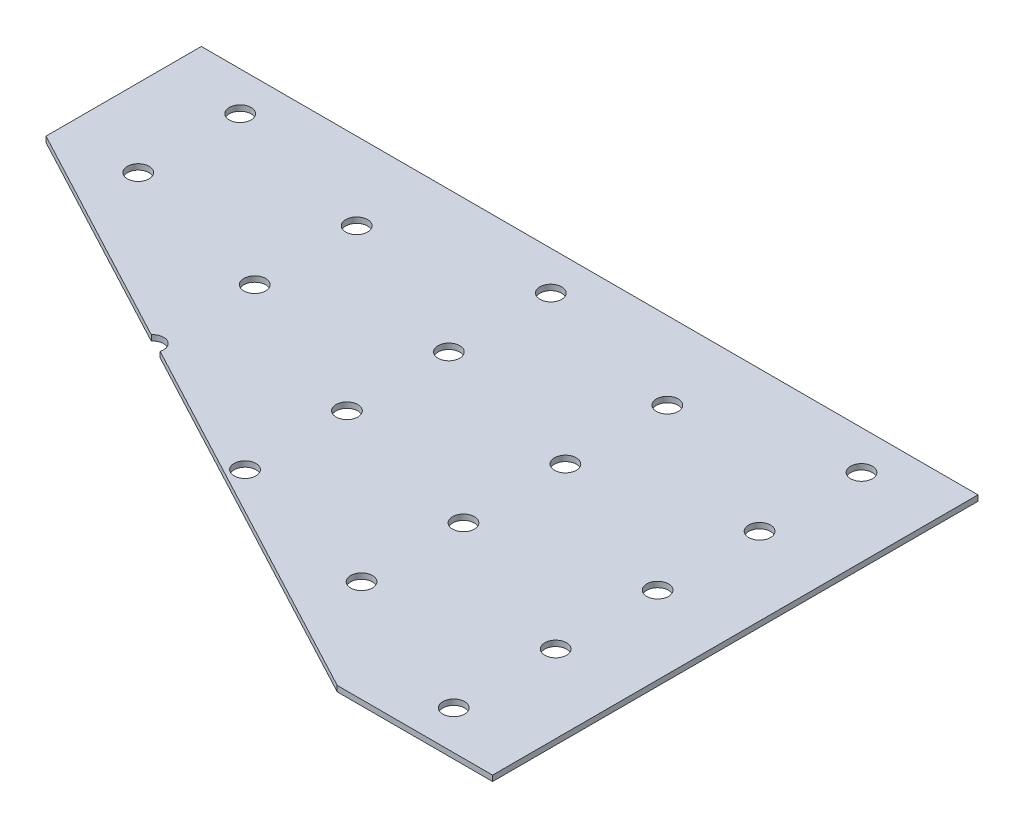
ISO-10303-21;
HEADER;
FILE_DESCRIPTION(('STEP AP214'),'2;1');
FILE_NAME('part.step','',(''),(''),'','','');
FILE_SCHEMA(('AUTOMOTIVE_DESIGN { 1 0 10303 214 1 1 1 1 }'));
ENDSEC;
DATA;
#1=APPLICATION_CONTEXT('core data for automotive mechanical design processes');
#2=APPLICATION_PROTOCOL_DEFINITION('international standard','automotive_design',2000,#1);
#3=PRODUCT_CONTEXT('',#1,'mechanical');
#4=PRODUCT('Part','Part','',(#3));
#5=PRODUCT_RELATED_PRODUCT_CATEGORY('part','',(#4));
#6=PRODUCT_DEFINITION_FORMATION('','',#4);
#7=PRODUCT_DEFINITION_CONTEXT('part definition',#1,'design');
#8=PRODUCT_DEFINITION('design','',#6,#7);
#9=PRODUCT_DEFINITION_SHAPE('','',#8);
#10=(LENGTH_UNIT() NAMED_UNIT(*) SI_UNIT(.MILLI.,.METRE.));
#11=(NAMED_UNIT(*) PLANE_ANGLE_UNIT() SI_UNIT($,.RADIAN.));
#12=(NAMED_UNIT(*) SI_UNIT($,.STERADIAN.) SOLID_ANGLE_UNIT());
#13=UNCERTAINTY_MEASURE_WITH_UNIT(LENGTH_MEASURE(1.E-05),#10,'distance_accuracy_value','');
#14=(GEOMETRIC_REPRESENTATION_CONTEXT(3) GLOBAL_UNCERTAINTY_ASSIGNED_CONTEXT((#13)) GLOBAL_UNIT_ASSIGNED_CONTEXT((#10,
#11,#12)) REPRESENTATION_CONTEXT('',''));
#15=CARTESIAN_POINT('',(0.,0.,0.));
#16=DIRECTION('',(0.,0.,1.));
#17=DIRECTION('',(1.,0.,0.));
#18=AXIS2_PLACEMENT_3D('',#15,#16,#17);
#19=CARTESIAN_POINT('',(0.,0.9144,0.));
#20=DIRECTION('',(0.,1.,0.));
#21=DIRECTION('',(0.,0.,1.));
#22=AXIS2_PLACEMENT_3D('',#19,#20,#21);
#23=PLANE('',#22);
#24=CARTESIAN_POINT('',(-50.8,0.9144,-33.3375));
#25=DIRECTION('',(0.,1.,0.));
#26=DIRECTION('',(0.,0.,1.));
#27=AXIS2_PLACEMENT_3D('',#24,#25,#26);
#28=CIRCLE('',#27,1.778);
#29=CARTESIAN_POINT('',(-50.8,0.9144,-31.5595));
#30=VERTEX_POINT('',#29);
#31=EDGE_CURVE('E177',#30,#30,#28,.F.);
#32=ORIENTED_EDGE('',*,*,#31,.T.);
#33=EDGE_LOOP('',(#32));
#34=FACE_BOUND('',#33,.T.);
#35=CARTESIAN_POINT('',(25.4,0.9144,23.01875));
#36=DIRECTION('',(0.,1.,0.));
#37=DIRECTION('',(0.,0.,1.));
#38=AXIS2_PLACEMENT_3D('',#35,#36,#37);
#39=CIRCLE('',#38,1.778);
#40=CARTESIAN_POINT('',(25.4,0.9144,24.79675));
#41=VERTEX_POINT('',#40);
#42=EDGE_CURVE('E180',#41,#41,#39,.F.);
#43=ORIENTED_EDGE('',*,*,#42,.T.);
#44=EDGE_LOOP('',(#43));
#45=FACE_BOUND('',#44,.T.);
#46=CARTESIAN_POINT('',(25.4,0.9144,6.35));
#47=DIRECTION('',(0.,1.,0.));
#48=DIRECTION('',(0.,0.,1.));
#49=AXIS2_PLACEMENT_3D('',#46,#47,#48);
#50=CIRCLE('',#49,1.778);
#51=CARTESIAN_POINT('',(25.4,0.9144,8.128));
#52=VERTEX_POINT('',#51);
#53=EDGE_CURVE('E183',#52,#52,#50,.F.);
#54=ORIENTED_EDGE('',*,*,#53,.T.);
#55=EDGE_LOOP('',(#54));
#56=FACE_BOUND('',#55,.T.);
#57=CARTESIAN_POINT('',(25.4,0.9144,-10.31875));
#58=DIRECTION('',(0.,1.,0.));
#59=DIRECTION('',(0.,0.,1.));
#60=AXIS2_PLACEMENT_3D('',#57,#58,#59);
#61=CIRCLE('',#60,1.778);
#62=CARTESIAN_POINT('',(25.4,0.9144,-8.54075));
#63=VERTEX_POINT('',#62);
#64=EDGE_CURVE('E186',#63,#63,#61,.F.);
#65=ORIENTED_EDGE('',*,*,#64,.T.);
#66=EDGE_LOOP('',(#65));
#67=FACE_BOUND('',#66,.T.);
#68=CARTESIAN_POINT('',(-25.4,0.9144,-10.31875));
#69=DIRECTION('',(0.,1.,0.));
#70=DIRECTION('',(0.,0.,1.));
#71=AXIS2_PLACEMENT_3D('',#68,#69,#70);
#72=CIRCLE('',#71,1.778);
#73=CARTESIAN_POINT('',(-25.4,0.9144,-8.54075));
#74=VERTEX_POINT('',#73);
#75=EDGE_CURVE('E189',#74,#74,#72,.F.);
#76=ORIENTED_EDGE('',*,*,#75,.T.);
#77=EDGE_LOOP('',(#76));
#78=FACE_BOUND('',#77,.T.);
#79=CARTESIAN_POINT('',(25.4,0.9144,-26.9875));
#80=DIRECTION('',(0.,1.,0.));
#81=DIRECTION('',(0.,0.,1.));
#82=AXIS2_PLACEMENT_3D('',#79,#80,#81);
#83=CIRCLE('',#82,1.778);
#84=CARTESIAN_POINT('',(25.4,0.9144,-25.2095));
#85=VERTEX_POINT('',#84);
#86=EDGE_CURVE('E192',#85,#85,#83,.F.);
#87=ORIENTED_EDGE('',*,*,#86,.T.);
#88=EDGE_LOOP('',(#87));
#89=FACE_BOUND('',#88,.T.);
#90=CARTESIAN_POINT('',(-25.4,0.9144,-26.9875));
#91=DIRECTION('',(0.,1.,0.));
#92=DIRECTION('',(0.,0.,1.));
#93=AXIS2_PLACEMENT_3D('',#90,#91,#92);
#94=CIRCLE('',#93,1.778);
#95=CARTESIAN_POINT('',(-25.4,0.9144,-25.2095));
#96=VERTEX_POINT('',#95);
#97=EDGE_CURVE('E195',#96,#96,#94,.F.);
#98=ORIENTED_EDGE('',*,*,#97,.T.);
#99=EDGE_LOOP('',(#98));
#100=FACE_BOUND('',#99,.T.);
#101=CARTESIAN_POINT('',(50.8,0.9144,33.3375));
#102=DIRECTION('',(0.,1.,0.));
#103=DIRECTION('',(0.,0.,1.));
#104=AXIS2_PLACEMENT_3D('',#101,#102,#103);
#105=CIRCLE('',#104,1.778);
#106=CARTESIAN_POINT('',(50.8,0.9144,35.1155));
#107=VERTEX_POINT('',#106);
#108=EDGE_CURVE('E198',#107,#107,#105,.F.);
#109=ORIENTED_EDGE('',*,*,#108,.T.);
#110=EDGE_LOOP('',(#109));
#111=FACE_BOUND('',#110,.T.);
#112=CARTESIAN_POINT('',(50.8,0.9144,16.66875));
#113=DIRECTION('',(0.,1.,0.));
#114=DIRECTION('',(0.,0.,1.));
#115=AXIS2_PLACEMENT_3D('',#112,#113,#114);
#116=CIRCLE('',#115,1.778);
#117=CARTESIAN_POINT('',(50.8,0.9144,18.44675));
#118=VERTEX_POINT('',#117);
#119=EDGE_CURVE('E201',#118,#118,#116,.F.);
#120=ORIENTED_EDGE('',*,*,#119,.T.);
#121=EDGE_LOOP('',(#120));
#122=FACE_BOUND('',#121,.T.);
#123=CARTESIAN_POINT('',(0.,0.9144,16.66875));
#124=DIRECTION('',(0.,1.,0.));
#125=DIRECTION('',(0.,0.,1.));
#126=AXIS2_PLACEMENT_3D('',#123,#124,#125);
#127=CIRCLE('',#126,1.778);
#128=CARTESIAN_POINT('',(0.,0.9144,18.44675));
#129=VERTEX_POINT('',#128);
#130=EDGE_CURVE('E204',#129,#129,#127,.F.);
#131=ORIENTED_EDGE('',*,*,#130,.T.);
#132=EDGE_LOOP('',(#131));
#133=FACE_BOUND('',#132,.T.);
#134=CARTESIAN_POINT('',(50.8,0.9144,0.));
#135=DIRECTION('',(0.,1.,0.));
#136=DIRECTION('',(0.,0.,1.));
#137=AXIS2_PLACEMENT_3D('',#134,#135,#136);
#138=CIRCLE('',#137,1.778);
#139=CARTESIAN_POINT('',(50.8,0.9144,1.778));
#140=VERTEX_POINT('',#139);
#141=EDGE_CURVE('E207',#140,#140,#138,.F.);
#142=ORIENTED_EDGE('',*,*,#141,.T.);
#143=EDGE_LOOP('',(#142));
#144=FACE_BOUND('',#143,.T.);
#145=CARTESIAN_POINT('',(0.,0.9144,0.));
#146=DIRECTION('',(0.,1.,0.));
#147=DIRECTION('',(0.,0.,1.));
#148=AXIS2_PLACEMENT_3D('',#145,#146,#147);
#149=CIRCLE('',#148,1.778);
#150=CARTESIAN_POINT('',(0.,0.9144,1.778));
#151=VERTEX_POINT('',#150);
#152=EDGE_CURVE('E210',#151,#151,#149,.F.);
#153=ORIENTED_EDGE('',*,*,#152,.T.);
#154=EDGE_LOOP('',(#153));
#155=FACE_BOUND('',#154,.T.);
#156=CARTESIAN_POINT('',(50.8,0.9144,-16.66875));
#157=DIRECTION('',(0.,1.,0.));
#158=DIRECTION('',(0.,0.,1.));
#159=AXIS2_PLACEMENT_3D('',#156,#157,#158);
#160=CIRCLE('',#159,1.778);
#161=CARTESIAN_POINT('',(50.8,0.9144,-14.89075));
#162=VERTEX_POINT('',#161);
#163=EDGE_CURVE('E213',#162,#162,#160,.F.);
#164=ORIENTED_EDGE('',*,*,#163,.T.);
#165=EDGE_LOOP('',(#164));
#166=FACE_BOUND('',#165,.T.);
#167=CARTESIAN_POINT('',(0.,0.9144,-16.66875));
#168=DIRECTION('',(0.,1.,0.));
#169=DIRECTION('',(0.,0.,1.));
#170=AXIS2_PLACEMENT_3D('',#167,#168,#169);
#171=CIRCLE('',#170,1.778);
#172=CARTESIAN_POINT('',(0.,0.9144,-14.89075));
#173=VERTEX_POINT('',#172);
#174=EDGE_CURVE('E216',#173,#173,#171,.F.);
#175=ORIENTED_EDGE('',*,*,#174,.T.);
#176=EDGE_LOOP('',(#175));
#177=FACE_BOUND('',#176,.T.);
#178=CARTESIAN_POINT('',(-50.8,0.9144,-16.66875));
#179=DIRECTION('',(0.,1.,0.));
#180=DIRECTION('',(0.,0.,1.));
#181=AXIS2_PLACEMENT_3D('',#178,#179,#180);
#182=CIRCLE('',#181,1.778);
#183=CARTESIAN_POINT('',(-50.8,0.9144,-14.89075));
#184=VERTEX_POINT('',#183);
#185=EDGE_CURVE('E219',#184,#184,#182,.F.);
#186=ORIENTED_EDGE('',*,*,#185,.T.);
#187=EDGE_LOOP('',(#186));
#188=FACE_BOUND('',#187,.T.);
#189=CARTESIAN_POINT('',(50.8,0.9144,-33.3375));
#190=DIRECTION('',(0.,1.,0.));
#191=DIRECTION('',(0.,0.,1.));
#192=AXIS2_PLACEMENT_3D('',#189,#190,#191);
#193=CIRCLE('',#192,1.778);
#194=CARTESIAN_POINT('',(50.8,0.9144,-31.5595));
#195=VERTEX_POINT('',#194);
#196=EDGE_CURVE('E222',#195,#195,#193,.F.);
#197=ORIENTED_EDGE('',*,*,#196,.T.);
#198=EDGE_LOOP('',(#197));
#199=FACE_BOUND('',#198,.T.);
#200=CARTESIAN_POINT('',(0.,0.9144,-33.3375));
#201=DIRECTION('',(0.,1.,0.));
#202=DIRECTION('',(0.,0.,1.));
#203=AXIS2_PLACEMENT_3D('',#200,#201,#202);
#204=CIRCLE('',#203,1.778);
#205=CARTESIAN_POINT('',(0.,0.9144,-31.5595));
#206=VERTEX_POINT('',#205);
#207=EDGE_CURVE('E224',#206,#206,#204,.F.);
#208=ORIENTED_EDGE('',*,*,#207,.T.);
#209=EDGE_LOOP('',(#208));
#210=FACE_BOUND('',#209,.T.);
#211=CARTESIAN_POINT('',(-25.4,0.9144,6.35));
#212=DIRECTION('',(0.,1.,0.));
#213=DIRECTION('',(0.,0.,1.));
#214=AXIS2_PLACEMENT_3D('',#211,#212,#213);
#215=CIRCLE('',#214,1.778);
#216=CARTESIAN_POINT('',(-26.7749379564742,0.9144,5.22268921062267));
#217=VERTEX_POINT('',#216);
#218=CARTESIAN_POINT('',(-23.6961968493143,0.9144,6.85827042380374));
#219=VERTEX_POINT('',#218);
#220=EDGE_CURVE('E19',#217,#219,#215,.F.);
#221=ORIENTED_EDGE('',*,*,#220,.T.);
#222=DIRECTION('',(-0.883115719457429,0.,-0.469155225961715));
#223=VECTOR('',#222,1.);
#224=CARTESIAN_POINT('',(38.1,0.9144,39.6875));
#225=LINE('',#224,#223);
#226=CARTESIAN_POINT('',(38.1,0.9144,39.6875));
#227=VERTEX_POINT('',#226);
#228=EDGE_CURVE('E91',#219,#227,#225,.F.);
#229=ORIENTED_EDGE('',*,*,#228,.T.);
#230=DIRECTION('',(1.,0.,0.));
#231=VECTOR('',#230,1.);
#232=CARTESIAN_POINT('',(-63.5,0.9144,39.6875));
#233=LINE('',#232,#231);
#234=CARTESIAN_POINT('',(63.5,0.9144,39.6875));
#235=VERTEX_POINT('',#234);
#236=EDGE_CURVE('E83',#235,#227,#233,.F.);
#237=ORIENTED_EDGE('',*,*,#236,.F.);
#238=DIRECTION('',(0.,0.,-1.));
#239=VECTOR('',#238,1.);
#240=CARTESIAN_POINT('',(63.5,0.9144,39.6875));
#241=LINE('',#240,#239);
#242=CARTESIAN_POINT('',(63.5,0.9144,-39.6875));
#243=VERTEX_POINT('',#242);
#244=EDGE_CURVE('E78',#243,#235,#241,.F.);
#245=ORIENTED_EDGE('',*,*,#244,.F.);
#246=DIRECTION('',(-1.,0.,0.));
#247=VECTOR('',#246,1.);
#248=CARTESIAN_POINT('',(63.5,0.9144,-39.6875));
#249=LINE('',#248,#247);
#250=CARTESIAN_POINT('',(-63.5,0.9144,-39.6875));
#251=VERTEX_POINT('',#250);
#252=EDGE_CURVE('E119',#251,#243,#249,.F.);
#253=ORIENTED_EDGE('',*,*,#252,.F.);
#254=DIRECTION('',(0.,0.,1.));
#255=VECTOR('',#254,1.);
#256=CARTESIAN_POINT('',(-63.5,0.9144,-39.6875));
#257=LINE('',#256,#255);
#258=CARTESIAN_POINT('',(-63.5000000000014,0.9144,-14.2874999999974));
#259=VERTEX_POINT('',#258);
#260=EDGE_CURVE('E58',#259,#251,#257,.F.);
#261=ORIENTED_EDGE('',*,*,#260,.F.);
#262=DIRECTION('',(-0.883115719457429,0.,-0.469155225961715));
#263=VECTOR('',#262,1.);
#264=CARTESIAN_POINT('',(38.1,0.9144,39.6875));
#265=LINE('',#264,#263);
#266=EDGE_CURVE('E107',#259,#217,#265,.F.);
#267=ORIENTED_EDGE('',*,*,#266,.T.);
#268=EDGE_LOOP('',(#221,#229,#237,#245,#253,#261,#267));
#269=FACE_BOUND('',#268,.T.);
#270=ADVANCED_FACE('F16',(#34,#45,#56,#67,#78,#89,#100,#111,#122,#133,#144,#155,#166,#177,#188,
#199,#210,#269),#23,.T.);
#271=CARTESIAN_POINT('',(38.1,0.9144,39.6875));
#272=DIRECTION('',(0.469155225961715,0.,-0.883115719457429));
#273=DIRECTION('',(-0.883115719457429,0.,-0.469155225961715));
#274=AXIS2_PLACEMENT_3D('',#271,#272,#273);
#275=PLANE('',#274);
#276=ORIENTED_EDGE('',*,*,#228,.F.);
#277=DIRECTION('',(0.,1.,0.));
#278=VECTOR('',#277,1.);
#279=CARTESIAN_POINT('',(-23.6961968493141,0.9144,6.85827042380281));
#280=LINE('',#279,#278);
#281=CARTESIAN_POINT('',(-23.6961968493141,0.,6.8582704238029));
#282=VERTEX_POINT('',#281);
#283=EDGE_CURVE('E228',#219,#282,#280,.F.);
#284=ORIENTED_EDGE('',*,*,#283,.T.);
#285=DIRECTION('',(0.883115719457417,0.,0.469155225961737));
#286=VECTOR('',#285,1.);
#287=CARTESIAN_POINT('',(-23.6961968493149,0.,6.85827042380256));
#288=LINE('',#287,#286);
#289=CARTESIAN_POINT('',(38.1,0.,39.6875));
#290=VERTEX_POINT('',#289);
#291=EDGE_CURVE('E98',#282,#290,#288,.T.);
#292=ORIENTED_EDGE('',*,*,#291,.T.);
#293=DIRECTION('',(0.,1.,0.));
#294=VECTOR('',#293,1.);
#295=CARTESIAN_POINT('',(38.1,0.,39.6875));
#296=LINE('',#295,#294);
#297=EDGE_CURVE('E88',#227,#290,#296,.F.);
#298=ORIENTED_EDGE('',*,*,#297,.F.);
#299=EDGE_LOOP('',(#276,#284,#292,#298));
#300=FACE_BOUND('',#299,.T.);
#301=ADVANCED_FACE('F97',(#300),#275,.F.);
#302=CARTESIAN_POINT('',(-63.5,0.,39.6875));
#303=DIRECTION('',(0.,0.,1.));
#304=DIRECTION('',(1.,0.,0.));
#305=AXIS2_PLACEMENT_3D('',#302,#303,#304);
#306=PLANE('',#305);
#307=ORIENTED_EDGE('',*,*,#236,.T.);
#308=ORIENTED_EDGE('',*,*,#297,.T.);
#309=DIRECTION('',(1.,0.,0.));
#310=VECTOR('',#309,1.);
#311=CARTESIAN_POINT('',(0.,0.,39.6875));
#312=LINE('',#311,#310);
#313=CARTESIAN_POINT('',(63.5,0.,39.6875));
#314=VERTEX_POINT('',#313);
#315=EDGE_CURVE('E259',#290,#314,#312,.T.);
#316=ORIENTED_EDGE('',*,*,#315,.T.);
#317=DIRECTION('',(0.,1.,0.));
#318=VECTOR('',#317,1.);
#319=CARTESIAN_POINT('',(63.5,0.,39.6875));
#320=LINE('',#319,#318);
#321=EDGE_CURVE('E90',#235,#314,#320,.F.);
#322=ORIENTED_EDGE('',*,*,#321,.F.);
#323=EDGE_LOOP('',(#307,#308,#316,#322));
#324=FACE_BOUND('',#323,.T.);
#325=ADVANCED_FACE('F85',(#324),#306,.T.);
#326=CARTESIAN_POINT('',(63.5,0.,39.6875));
#327=DIRECTION('',(1.,0.,0.));
#328=DIRECTION('',(0.,0.,-1.));
#329=AXIS2_PLACEMENT_3D('',#326,#327,#328);
#330=PLANE('',#329);
#331=ORIENTED_EDGE('',*,*,#321,.T.);
#332=DIRECTION('',(0.,0.,1.));
#333=VECTOR('',#332,1.);
#334=CARTESIAN_POINT('',(63.5,0.,0.));
#335=LINE('',#334,#333);
#336=CARTESIAN_POINT('',(63.5,0.,-39.6875));
#337=VERTEX_POINT('',#336);
#338=EDGE_CURVE('E251',#314,#337,#335,.F.);
#339=ORIENTED_EDGE('',*,*,#338,.T.);
#340=DIRECTION('',(0.,1.,0.));
#341=VECTOR('',#340,1.);
#342=CARTESIAN_POINT('',(63.5,0.,-39.6875));
#343=LINE('',#342,#341);
#344=EDGE_CURVE('E116',#243,#337,#343,.F.);
#345=ORIENTED_EDGE('',*,*,#344,.F.);
#346=ORIENTED_EDGE('',*,*,#244,.T.);
#347=EDGE_LOOP('',(#331,#339,#345,#346));
#348=FACE_BOUND('',#347,.T.);
#349=ADVANCED_FACE('F281',(#348),#330,.T.);
#350=CARTESIAN_POINT('',(63.5,0.,-39.6875));
#351=DIRECTION('',(0.,0.,-1.));
#352=DIRECTION('',(-1.,0.,0.));
#353=AXIS2_PLACEMENT_3D('',#350,#351,#352);
#354=PLANE('',#353);
#355=ORIENTED_EDGE('',*,*,#344,.T.);
#356=DIRECTION('',(1.,0.,0.));
#357=VECTOR('',#356,1.);
#358=CARTESIAN_POINT('',(0.,0.,-39.6875));
#359=LINE('',#358,#357);
#360=CARTESIAN_POINT('',(-63.5,0.,-39.6875));
#361=VERTEX_POINT('',#360);
#362=EDGE_CURVE('E242',#337,#361,#359,.F.);
#363=ORIENTED_EDGE('',*,*,#362,.T.);
#364=DIRECTION('',(0.,1.,0.));
#365=VECTOR('',#364,1.);
#366=CARTESIAN_POINT('',(-63.5,0.,-39.6875));
#367=LINE('',#366,#365);
#368=EDGE_CURVE('E115',#251,#361,#367,.F.);
#369=ORIENTED_EDGE('',*,*,#368,.F.);
#370=ORIENTED_EDGE('',*,*,#252,.T.);
#371=EDGE_LOOP('',(#355,#363,#369,#370));
#372=FACE_BOUND('',#371,.T.);
#373=ADVANCED_FACE('F279',(#372),#354,.T.);
#374=CARTESIAN_POINT('',(-63.5,0.,-39.6875));
#375=DIRECTION('',(-1.,0.,0.));
#376=DIRECTION('',(0.,0.,1.));
#377=AXIS2_PLACEMENT_3D('',#374,#375,#376);
#378=PLANE('',#377);
#379=DIRECTION('',(0.,0.,1.));
#380=VECTOR('',#379,1.);
#381=CARTESIAN_POINT('',(-63.5,0.,0.));
#382=LINE('',#381,#380);
#383=CARTESIAN_POINT('',(-63.5000000000007,0.,-14.2874999999987));
#384=VERTEX_POINT('',#383);
#385=EDGE_CURVE('E239',#361,#384,#382,.T.);
#386=ORIENTED_EDGE('',*,*,#385,.T.);
#387=DIRECTION('',(0.,1.,0.));
#388=VECTOR('',#387,1.);
#389=CARTESIAN_POINT('',(-63.5000000000021,0.9144,-14.2874999999961));
#390=LINE('',#389,#388);
#391=EDGE_CURVE('E109',#384,#259,#390,.T.);
#392=ORIENTED_EDGE('',*,*,#391,.T.);
#393=ORIENTED_EDGE('',*,*,#260,.T.);
#394=ORIENTED_EDGE('',*,*,#368,.T.);
#395=EDGE_LOOP('',(#386,#392,#393,#394));
#396=FACE_BOUND('',#395,.T.);
#397=ADVANCED_FACE('F276',(#396),#378,.T.);
#398=CARTESIAN_POINT('',(38.1,0.9144,39.6875));
#399=DIRECTION('',(0.469155225961715,0.,-0.883115719457429));
#400=DIRECTION('',(-0.883115719457429,0.,-0.469155225961715));
#401=AXIS2_PLACEMENT_3D('',#398,#399,#400);
#402=PLANE('',#401);
#403=ORIENTED_EDGE('',*,*,#266,.F.);
#404=ORIENTED_EDGE('',*,*,#391,.F.);
#405=DIRECTION('',(0.883115719457441,0.,0.469155225961693));
#406=VECTOR('',#405,1.);
#407=CARTESIAN_POINT('',(-63.5,0.,-14.2875));
#408=LINE('',#407,#406);
#409=CARTESIAN_POINT('',(-26.7749379564724,0.,5.2226892106205));
#410=VERTEX_POINT('',#409);
#411=EDGE_CURVE('E176',#384,#410,#408,.T.);
#412=ORIENTED_EDGE('',*,*,#411,.T.);
#413=DIRECTION('',(0.,1.,0.));
#414=VECTOR('',#413,1.);
#415=CARTESIAN_POINT('',(-26.7749379564721,0.9144,5.22268921062014));
#416=LINE('',#415,#414);
#417=EDGE_CURVE('E34',#410,#217,#416,.T.);
#418=ORIENTED_EDGE('',*,*,#417,.T.);
#419=EDGE_LOOP('',(#403,#404,#412,#418));
#420=FACE_BOUND('',#419,.T.);
#421=ADVANCED_FACE('F270',(#420),#402,.F.);
#422=CARTESIAN_POINT('',(-25.4,0.9144,6.35));
#423=DIRECTION('',(0.,1.,0.));
#424=DIRECTION('',(0.,0.,1.));
#425=AXIS2_PLACEMENT_3D('',#422,#423,#424);
#426=CYLINDRICAL_SURFACE('',#425,1.778);
#427=CARTESIAN_POINT('',(-25.4,0.,6.35));
#428=DIRECTION('',(0.,1.,0.));
#429=DIRECTION('',(0.,0.,1.));
#430=AXIS2_PLACEMENT_3D('',#427,#428,#429);
#431=CIRCLE('',#430,1.778);
#432=EDGE_CURVE('E174',#410,#282,#431,.F.);
#433=ORIENTED_EDGE('',*,*,#432,.T.);
#434=ORIENTED_EDGE('',*,*,#283,.F.);
#435=ORIENTED_EDGE('',*,*,#220,.F.);
#436=ORIENTED_EDGE('',*,*,#417,.F.);
#437=EDGE_LOOP('',(#433,#434,#435,#436));
#438=FACE_BOUND('',#437,.T.);
#439=ADVANCED_FACE('F366',(#438),#426,.F.);
#440=CARTESIAN_POINT('',(0.,0.9144,-33.3375));
#441=DIRECTION('',(0.,1.,0.));
#442=DIRECTION('',(0.,0.,1.));
#443=AXIS2_PLACEMENT_3D('',#440,#441,#442);
#444=CYLINDRICAL_SURFACE('',#443,1.778);
#445=ORIENTED_EDGE('',*,*,#207,.F.);
#446=EDGE_LOOP('',(#445));
#447=FACE_BOUND('',#446,.T.);
#448=CARTESIAN_POINT('',(0.,0.,-33.3375));
#449=DIRECTION('',(0.,1.,0.));
#450=DIRECTION('',(0.,0.,1.));
#451=AXIS2_PLACEMENT_3D('',#448,#449,#450);
#452=CIRCLE('',#451,1.778);
#453=CARTESIAN_POINT('',(0.,0.,-31.5595));
#454=VERTEX_POINT('',#453);
#455=EDGE_CURVE('E171',#454,#454,#452,.F.);
#456=ORIENTED_EDGE('',*,*,#455,.T.);
#457=EDGE_LOOP('',(#456));
#458=FACE_BOUND('',#457,.T.);
#459=ADVANCED_FACE('F362',(#447,#458),#444,.F.);
#460=CARTESIAN_POINT('',(50.8,0.9144,-33.3375));
#461=DIRECTION('',(0.,1.,0.));
#462=DIRECTION('',(0.,0.,1.));
#463=AXIS2_PLACEMENT_3D('',#460,#461,#462);
#464=CYLINDRICAL_SURFACE('',#463,1.778);
#465=ORIENTED_EDGE('',*,*,#196,.F.);
#466=EDGE_LOOP('',(#465));
#467=FACE_BOUND('',#466,.T.);
#468=CARTESIAN_POINT('',(50.8,0.,-33.3375));
#469=DIRECTION('',(0.,1.,0.));
#470=DIRECTION('',(0.,0.,1.));
#471=AXIS2_PLACEMENT_3D('',#468,#469,#470);
#472=CIRCLE('',#471,1.778);
#473=CARTESIAN_POINT('',(50.8,0.,-31.5595));
#474=VERTEX_POINT('',#473);
#475=EDGE_CURVE('E168',#474,#474,#472,.F.);
#476=ORIENTED_EDGE('',*,*,#475,.T.);
#477=EDGE_LOOP('',(#476));
#478=FACE_BOUND('',#477,.T.);
#479=ADVANCED_FACE('F358',(#467,#478),#464,.F.);
#480=CARTESIAN_POINT('',(-50.8,0.9144,-16.66875));
#481=DIRECTION('',(0.,1.,0.));
#482=DIRECTION('',(0.,0.,1.));
#483=AXIS2_PLACEMENT_3D('',#480,#481,#482);
#484=CYLINDRICAL_SURFACE('',#483,1.778);
#485=ORIENTED_EDGE('',*,*,#185,.F.);
#486=EDGE_LOOP('',(#485));
#487=FACE_BOUND('',#486,.T.);
#488=CARTESIAN_POINT('',(-50.8,0.,-16.66875));
#489=DIRECTION('',(0.,1.,0.));
#490=DIRECTION('',(0.,0.,1.));
#491=AXIS2_PLACEMENT_3D('',#488,#489,#490);
#492=CIRCLE('',#491,1.778);
#493=CARTESIAN_POINT('',(-50.8,0.,-14.89075));
#494=VERTEX_POINT('',#493);
#495=EDGE_CURVE('E165',#494,#494,#492,.F.);
#496=ORIENTED_EDGE('',*,*,#495,.T.);
#497=EDGE_LOOP('',(#496));
#498=FACE_BOUND('',#497,.T.);
#499=ADVANCED_FACE('F354',(#487,#498),#484,.F.);
#500=CARTESIAN_POINT('',(0.,0.9144,-16.66875));
#501=DIRECTION('',(0.,1.,0.));
#502=DIRECTION('',(0.,0.,1.));
#503=AXIS2_PLACEMENT_3D('',#500,#501,#502);
#504=CYLINDRICAL_SURFACE('',#503,1.778);
#505=ORIENTED_EDGE('',*,*,#174,.F.);
#506=EDGE_LOOP('',(#505));
#507=FACE_BOUND('',#506,.T.);
#508=CARTESIAN_POINT('',(0.,0.,-16.66875));
#509=DIRECTION('',(0.,1.,0.));
#510=DIRECTION('',(0.,0.,1.));
#511=AXIS2_PLACEMENT_3D('',#508,#509,#510);
#512=CIRCLE('',#511,1.778);
#513=CARTESIAN_POINT('',(0.,0.,-14.89075));
#514=VERTEX_POINT('',#513);
#515=EDGE_CURVE('E162',#514,#514,#512,.F.);
#516=ORIENTED_EDGE('',*,*,#515,.T.);
#517=EDGE_LOOP('',(#516));
#518=FACE_BOUND('',#517,.T.);
#519=ADVANCED_FACE('F350',(#507,#518),#504,.F.);
#520=CARTESIAN_POINT('',(50.8,0.9144,-16.66875));
#521=DIRECTION('',(0.,1.,0.));
#522=DIRECTION('',(0.,0.,1.));
#523=AXIS2_PLACEMENT_3D('',#520,#521,#522);
#524=CYLINDRICAL_SURFACE('',#523,1.778);
#525=ORIENTED_EDGE('',*,*,#163,.F.);
#526=EDGE_LOOP('',(#525));
#527=FACE_BOUND('',#526,.T.);
#528=CARTESIAN_POINT('',(50.8,0.,-16.66875));
#529=DIRECTION('',(0.,1.,0.));
#530=DIRECTION('',(0.,0.,1.));
#531=AXIS2_PLACEMENT_3D('',#528,#529,#530);
#532=CIRCLE('',#531,1.778);
#533=CARTESIAN_POINT('',(50.8,0.,-14.89075));
#534=VERTEX_POINT('',#533);
#535=EDGE_CURVE('E159',#534,#534,#532,.F.);
#536=ORIENTED_EDGE('',*,*,#535,.T.);
#537=EDGE_LOOP('',(#536));
#538=FACE_BOUND('',#537,.T.);
#539=ADVANCED_FACE('F346',(#527,#538),#524,.F.);
#540=CARTESIAN_POINT('',(0.,0.9144,0.));
#541=DIRECTION('',(0.,1.,0.));
#542=DIRECTION('',(0.,0.,1.));
#543=AXIS2_PLACEMENT_3D('',#540,#541,#542);
#544=CYLINDRICAL_SURFACE('',#543,1.778);
#545=ORIENTED_EDGE('',*,*,#152,.F.);
#546=EDGE_LOOP('',(#545));
#547=FACE_BOUND('',#546,.T.);
#548=CARTESIAN_POINT('',(0.,0.,0.));
#549=DIRECTION('',(0.,1.,0.));
#550=DIRECTION('',(0.,0.,1.));
#551=AXIS2_PLACEMENT_3D('',#548,#549,#550);
#552=CIRCLE('',#551,1.778);
#553=CARTESIAN_POINT('',(0.,0.,1.778));
#554=VERTEX_POINT('',#553);
#555=EDGE_CURVE('E156',#554,#554,#552,.F.);
#556=ORIENTED_EDGE('',*,*,#555,.T.);
#557=EDGE_LOOP('',(#556));
#558=FACE_BOUND('',#557,.T.);
#559=ADVANCED_FACE('F342',(#547,#558),#544,.F.);
#560=CARTESIAN_POINT('',(50.8,0.9144,0.));
#561=DIRECTION('',(0.,1.,0.));
#562=DIRECTION('',(0.,0.,1.));
#563=AXIS2_PLACEMENT_3D('',#560,#561,#562);
#564=CYLINDRICAL_SURFACE('',#563,1.778);
#565=ORIENTED_EDGE('',*,*,#141,.F.);
#566=EDGE_LOOP('',(#565));
#567=FACE_BOUND('',#566,.T.);
#568=CARTESIAN_POINT('',(50.8,0.,0.));
#569=DIRECTION('',(0.,1.,0.));
#570=DIRECTION('',(0.,0.,1.));
#571=AXIS2_PLACEMENT_3D('',#568,#569,#570);
#572=CIRCLE('',#571,1.778);
#573=CARTESIAN_POINT('',(50.8,0.,1.778));
#574=VERTEX_POINT('',#573);
#575=EDGE_CURVE('E153',#574,#574,#572,.F.);
#576=ORIENTED_EDGE('',*,*,#575,.T.);
#577=EDGE_LOOP('',(#576));
#578=FACE_BOUND('',#577,.T.);
#579=ADVANCED_FACE('F338',(#567,#578),#564,.F.);
#580=CARTESIAN_POINT('',(0.,0.9144,16.66875));
#581=DIRECTION('',(0.,1.,0.));
#582=DIRECTION('',(0.,0.,1.));
#583=AXIS2_PLACEMENT_3D('',#580,#581,#582);
#584=CYLINDRICAL_SURFACE('',#583,1.778);
#585=ORIENTED_EDGE('',*,*,#130,.F.);
#586=EDGE_LOOP('',(#585));
#587=FACE_BOUND('',#586,.T.);
#588=CARTESIAN_POINT('',(0.,0.,16.66875));
#589=DIRECTION('',(0.,1.,0.));
#590=DIRECTION('',(0.,0.,1.));
#591=AXIS2_PLACEMENT_3D('',#588,#589,#590);
#592=CIRCLE('',#591,1.778);
#593=CARTESIAN_POINT('',(0.,0.,18.44675));
#594=VERTEX_POINT('',#593);
#595=EDGE_CURVE('E150',#594,#594,#592,.F.);
#596=ORIENTED_EDGE('',*,*,#595,.T.);
#597=EDGE_LOOP('',(#596));
#598=FACE_BOUND('',#597,.T.);
#599=ADVANCED_FACE('F334',(#587,#598),#584,.F.);
#600=CARTESIAN_POINT('',(50.8,0.9144,16.66875));
#601=DIRECTION('',(0.,1.,0.));
#602=DIRECTION('',(0.,0.,1.));
#603=AXIS2_PLACEMENT_3D('',#600,#601,#602);
#604=CYLINDRICAL_SURFACE('',#603,1.778);
#605=ORIENTED_EDGE('',*,*,#119,.F.);
#606=EDGE_LOOP('',(#605));
#607=FACE_BOUND('',#606,.T.);
#608=CARTESIAN_POINT('',(50.8,0.,16.66875));
#609=DIRECTION('',(0.,1.,0.));
#610=DIRECTION('',(0.,0.,1.));
#611=AXIS2_PLACEMENT_3D('',#608,#609,#610);
#612=CIRCLE('',#611,1.778);
#613=CARTESIAN_POINT('',(50.8,0.,18.44675));
#614=VERTEX_POINT('',#613);
#615=EDGE_CURVE('E147',#614,#614,#612,.F.);
#616=ORIENTED_EDGE('',*,*,#615,.T.);
#617=EDGE_LOOP('',(#616));
#618=FACE_BOUND('',#617,.T.);
#619=ADVANCED_FACE('F330',(#607,#618),#604,.F.);
#620=CARTESIAN_POINT('',(50.8,0.9144,33.3375));
#621=DIRECTION('',(0.,1.,0.));
#622=DIRECTION('',(0.,0.,1.));
#623=AXIS2_PLACEMENT_3D('',#620,#621,#622);
#624=CYLINDRICAL_SURFACE('',#623,1.778);
#625=ORIENTED_EDGE('',*,*,#108,.F.);
#626=EDGE_LOOP('',(#625));
#627=FACE_BOUND('',#626,.T.);
#628=CARTESIAN_POINT('',(50.8,0.,33.3375));
#629=DIRECTION('',(0.,1.,0.));
#630=DIRECTION('',(0.,0.,1.));
#631=AXIS2_PLACEMENT_3D('',#628,#629,#630);
#632=CIRCLE('',#631,1.778);
#633=CARTESIAN_POINT('',(50.8,0.,35.1155));
#634=VERTEX_POINT('',#633);
#635=EDGE_CURVE('E144',#634,#634,#632,.F.);
#636=ORIENTED_EDGE('',*,*,#635,.T.);
#637=EDGE_LOOP('',(#636));
#638=FACE_BOUND('',#637,.T.);
#639=ADVANCED_FACE('F326',(#627,#638),#624,.F.);
#640=CARTESIAN_POINT('',(-25.4,0.9144,-26.9875));
#641=DIRECTION('',(0.,1.,0.));
#642=DIRECTION('',(0.,0.,1.));
#643=AXIS2_PLACEMENT_3D('',#640,#641,#642);
#644=CYLINDRICAL_SURFACE('',#643,1.778);
#645=ORIENTED_EDGE('',*,*,#97,.F.);
#646=EDGE_LOOP('',(#645));
#647=FACE_BOUND('',#646,.T.);
#648=CARTESIAN_POINT('',(-25.4,0.,-26.9875));
#649=DIRECTION('',(0.,1.,0.));
#650=DIRECTION('',(0.,0.,1.));
#651=AXIS2_PLACEMENT_3D('',#648,#649,#650);
#652=CIRCLE('',#651,1.778);
#653=CARTESIAN_POINT('',(-25.4,0.,-25.2095));
#654=VERTEX_POINT('',#653);
#655=EDGE_CURVE('E141',#654,#654,#652,.F.);
#656=ORIENTED_EDGE('',*,*,#655,.T.);
#657=EDGE_LOOP('',(#656));
#658=FACE_BOUND('',#657,.T.);
#659=ADVANCED_FACE('F322',(#647,#658),#644,.F.);
#660=CARTESIAN_POINT('',(25.4,0.9144,-26.9875));
#661=DIRECTION('',(0.,1.,0.));
#662=DIRECTION('',(0.,0.,1.));
#663=AXIS2_PLACEMENT_3D('',#660,#661,#662);
#664=CYLINDRICAL_SURFACE('',#663,1.778);
#665=ORIENTED_EDGE('',*,*,#86,.F.);
#666=EDGE_LOOP('',(#665));
#667=FACE_BOUND('',#666,.T.);
#668=CARTESIAN_POINT('',(25.4,0.,-26.9875));
#669=DIRECTION('',(0.,1.,0.));
#670=DIRECTION('',(0.,0.,1.));
#671=AXIS2_PLACEMENT_3D('',#668,#669,#670);
#672=CIRCLE('',#671,1.778);
#673=CARTESIAN_POINT('',(25.4,0.,-25.2095));
#674=VERTEX_POINT('',#673);
#675=EDGE_CURVE('E138',#674,#674,#672,.F.);
#676=ORIENTED_EDGE('',*,*,#675,.T.);
#677=EDGE_LOOP('',(#676));
#678=FACE_BOUND('',#677,.T.);
#679=ADVANCED_FACE('F318',(#667,#678),#664,.F.);
#680=CARTESIAN_POINT('',(-25.4,0.9144,-10.31875));
#681=DIRECTION('',(0.,1.,0.));
#682=DIRECTION('',(0.,0.,1.));
#683=AXIS2_PLACEMENT_3D('',#680,#681,#682);
#684=CYLINDRICAL_SURFACE('',#683,1.778);
#685=ORIENTED_EDGE('',*,*,#75,.F.);
#686=EDGE_LOOP('',(#685));
#687=FACE_BOUND('',#686,.T.);
#688=CARTESIAN_POINT('',(-25.4,0.,-10.31875));
#689=DIRECTION('',(0.,1.,0.));
#690=DIRECTION('',(0.,0.,1.));
#691=AXIS2_PLACEMENT_3D('',#688,#689,#690);
#692=CIRCLE('',#691,1.778);
#693=CARTESIAN_POINT('',(-25.4,0.,-8.54075));
#694=VERTEX_POINT('',#693);
#695=EDGE_CURVE('E135',#694,#694,#692,.F.);
#696=ORIENTED_EDGE('',*,*,#695,.T.);
#697=EDGE_LOOP('',(#696));
#698=FACE_BOUND('',#697,.T.);
#699=ADVANCED_FACE('F314',(#687,#698),#684,.F.);
#700=CARTESIAN_POINT('',(25.4,0.9144,-10.31875));
#701=DIRECTION('',(0.,1.,0.));
#702=DIRECTION('',(0.,0.,1.));
#703=AXIS2_PLACEMENT_3D('',#700,#701,#702);
#704=CYLINDRICAL_SURFACE('',#703,1.778);
#705=ORIENTED_EDGE('',*,*,#64,.F.);
#706=EDGE_LOOP('',(#705));
#707=FACE_BOUND('',#706,.T.);
#708=CARTESIAN_POINT('',(25.4,0.,-10.31875));
#709=DIRECTION('',(0.,1.,0.));
#710=DIRECTION('',(0.,0.,1.));
#711=AXIS2_PLACEMENT_3D('',#708,#709,#710);
#712=CIRCLE('',#711,1.778);
#713=CARTESIAN_POINT('',(25.4,0.,-8.54075));
#714=VERTEX_POINT('',#713);
#715=EDGE_CURVE('E132',#714,#714,#712,.F.);
#716=ORIENTED_EDGE('',*,*,#715,.T.);
#717=EDGE_LOOP('',(#716));
#718=FACE_BOUND('',#717,.T.);
#719=ADVANCED_FACE('F310',(#707,#718),#704,.F.);
#720=CARTESIAN_POINT('',(25.4,0.9144,6.35));
#721=DIRECTION('',(0.,1.,0.));
#722=DIRECTION('',(0.,0.,1.));
#723=AXIS2_PLACEMENT_3D('',#720,#721,#722);
#724=CYLINDRICAL_SURFACE('',#723,1.778);
#725=ORIENTED_EDGE('',*,*,#53,.F.);
#726=EDGE_LOOP('',(#725));
#727=FACE_BOUND('',#726,.T.);
#728=CARTESIAN_POINT('',(25.4,0.,6.35));
#729=DIRECTION('',(0.,1.,0.));
#730=DIRECTION('',(0.,0.,1.));
#731=AXIS2_PLACEMENT_3D('',#728,#729,#730);
#732=CIRCLE('',#731,1.778);
#733=CARTESIAN_POINT('',(25.4,0.,8.128));
#734=VERTEX_POINT('',#733);
#735=EDGE_CURVE('E129',#734,#734,#732,.F.);
#736=ORIENTED_EDGE('',*,*,#735,.T.);
#737=EDGE_LOOP('',(#736));
#738=FACE_BOUND('',#737,.T.);
#739=ADVANCED_FACE('F306',(#727,#738),#724,.F.);
#740=CARTESIAN_POINT('',(25.4,0.9144,23.01875));
#741=DIRECTION('',(0.,1.,0.));
#742=DIRECTION('',(0.,0.,1.));
#743=AXIS2_PLACEMENT_3D('',#740,#741,#742);
#744=CYLINDRICAL_SURFACE('',#743,1.778);
#745=ORIENTED_EDGE('',*,*,#42,.F.);
#746=EDGE_LOOP('',(#745));
#747=FACE_BOUND('',#746,.T.);
#748=CARTESIAN_POINT('',(25.4,0.,23.01875));
#749=DIRECTION('',(0.,1.,0.));
#750=DIRECTION('',(0.,0.,1.));
#751=AXIS2_PLACEMENT_3D('',#748,#749,#750);
#752=CIRCLE('',#751,1.778);
#753=CARTESIAN_POINT('',(25.4,0.,24.79675));
#754=VERTEX_POINT('',#753);
#755=EDGE_CURVE('E25',#754,#754,#752,.F.);
#756=ORIENTED_EDGE('',*,*,#755,.T.);
#757=EDGE_LOOP('',(#756));
#758=FACE_BOUND('',#757,.T.);
#759=ADVANCED_FACE('F298',(#747,#758),#744,.F.);
#760=CARTESIAN_POINT('',(-50.8,0.9144,-33.3375));
#761=DIRECTION('',(0.,1.,0.));
#762=DIRECTION('',(0.,0.,1.));
#763=AXIS2_PLACEMENT_3D('',#760,#761,#762);
#764=CYLINDRICAL_SURFACE('',#763,1.778);
#765=ORIENTED_EDGE('',*,*,#31,.F.);
#766=EDGE_LOOP('',(#765));
#767=FACE_BOUND('',#766,.T.);
#768=CARTESIAN_POINT('',(-50.8,0.,-33.3375));
#769=DIRECTION('',(0.,1.,0.));
#770=DIRECTION('',(0.,0.,1.));
#771=AXIS2_PLACEMENT_3D('',#768,#769,#770);
#772=CIRCLE('',#771,1.778);
#773=CARTESIAN_POINT('',(-50.8,0.,-31.5595));
#774=VERTEX_POINT('',#773);
#775=EDGE_CURVE('E11',#774,#774,#772,.F.);
#776=ORIENTED_EDGE('',*,*,#775,.T.);
#777=EDGE_LOOP('',(#776));
#778=FACE_BOUND('',#777,.T.);
#779=ADVANCED_FACE('F292',(#767,#778),#764,.F.);
#780=CARTESIAN_POINT('',(0.,0.,0.));
#781=DIRECTION('',(0.,1.,0.));
#782=DIRECTION('',(0.,0.,1.));
#783=AXIS2_PLACEMENT_3D('',#780,#781,#782);
#784=PLANE('',#783);
#785=ORIENTED_EDGE('',*,*,#775,.F.);
#786=EDGE_LOOP('',(#785));
#787=FACE_BOUND('',#786,.T.);
#788=ORIENTED_EDGE('',*,*,#755,.F.);
#789=EDGE_LOOP('',(#788));
#790=FACE_BOUND('',#789,.T.);
#791=ORIENTED_EDGE('',*,*,#735,.F.);
#792=EDGE_LOOP('',(#791));
#793=FACE_BOUND('',#792,.T.);
#794=ORIENTED_EDGE('',*,*,#715,.F.);
#795=EDGE_LOOP('',(#794));
#796=FACE_BOUND('',#795,.T.);
#797=ORIENTED_EDGE('',*,*,#695,.F.);
#798=EDGE_LOOP('',(#797));
#799=FACE_BOUND('',#798,.T.);
#800=ORIENTED_EDGE('',*,*,#675,.F.);
#801=EDGE_LOOP('',(#800));
#802=FACE_BOUND('',#801,.T.);
#803=ORIENTED_EDGE('',*,*,#655,.F.);
#804=EDGE_LOOP('',(#803));
#805=FACE_BOUND('',#804,.T.);
#806=ORIENTED_EDGE('',*,*,#635,.F.);
#807=EDGE_LOOP('',(#806));
#808=FACE_BOUND('',#807,.T.);
#809=ORIENTED_EDGE('',*,*,#615,.F.);
#810=EDGE_LOOP('',(#809));
#811=FACE_BOUND('',#810,.T.);
#812=ORIENTED_EDGE('',*,*,#595,.F.);
#813=EDGE_LOOP('',(#812));
#814=FACE_BOUND('',#813,.T.);
#815=ORIENTED_EDGE('',*,*,#575,.F.);
#816=EDGE_LOOP('',(#815));
#817=FACE_BOUND('',#816,.T.);
#818=ORIENTED_EDGE('',*,*,#555,.F.);
#819=EDGE_LOOP('',(#818));
#820=FACE_BOUND('',#819,.T.);
#821=ORIENTED_EDGE('',*,*,#535,.F.);
#822=EDGE_LOOP('',(#821));
#823=FACE_BOUND('',#822,.T.);
#824=ORIENTED_EDGE('',*,*,#515,.F.);
#825=EDGE_LOOP('',(#824));
#826=FACE_BOUND('',#825,.T.);
#827=ORIENTED_EDGE('',*,*,#495,.F.);
#828=EDGE_LOOP('',(#827));
#829=FACE_BOUND('',#828,.T.);
#830=ORIENTED_EDGE('',*,*,#475,.F.);
#831=EDGE_LOOP('',(#830));
#832=FACE_BOUND('',#831,.T.);
#833=ORIENTED_EDGE('',*,*,#455,.F.);
#834=EDGE_LOOP('',(#833));
#835=FACE_BOUND('',#834,.T.);
#836=ORIENTED_EDGE('',*,*,#411,.F.);
#837=ORIENTED_EDGE('',*,*,#385,.F.);
#838=ORIENTED_EDGE('',*,*,#362,.F.);
#839=ORIENTED_EDGE('',*,*,#338,.F.);
#840=ORIENTED_EDGE('',*,*,#315,.F.);
#841=ORIENTED_EDGE('',*,*,#291,.F.);
#842=ORIENTED_EDGE('',*,*,#432,.F.);
#843=EDGE_LOOP('',(#836,#837,#838,#839,#840,#841,#842));
#844=FACE_BOUND('',#843,.T.);
#845=ADVANCED_FACE('F273',(#787,#790,#793,#796,#799,#802,#805,#808,#811,#814,#817,#820,#823,
#826,#829,#832,#835,#844),#784,.F.);
#846=CLOSED_SHELL('',(#270,#301,#325,#349,#373,#397,#421,#439,#459,#479,#499,#519,#539,#559,
#579,#599,#619,#639,#659,#679,#699,#719,#739,#759,#779,#845));
#847=MANIFOLD_SOLID_BREP('B1',#846);
#848=ADVANCED_BREP_SHAPE_REPRESENTATION('',(#18,#847),#14);
#849=SHAPE_DEFINITION_REPRESENTATION(#9,#848);
ENDSEC;
END-ISO-10303-21;
